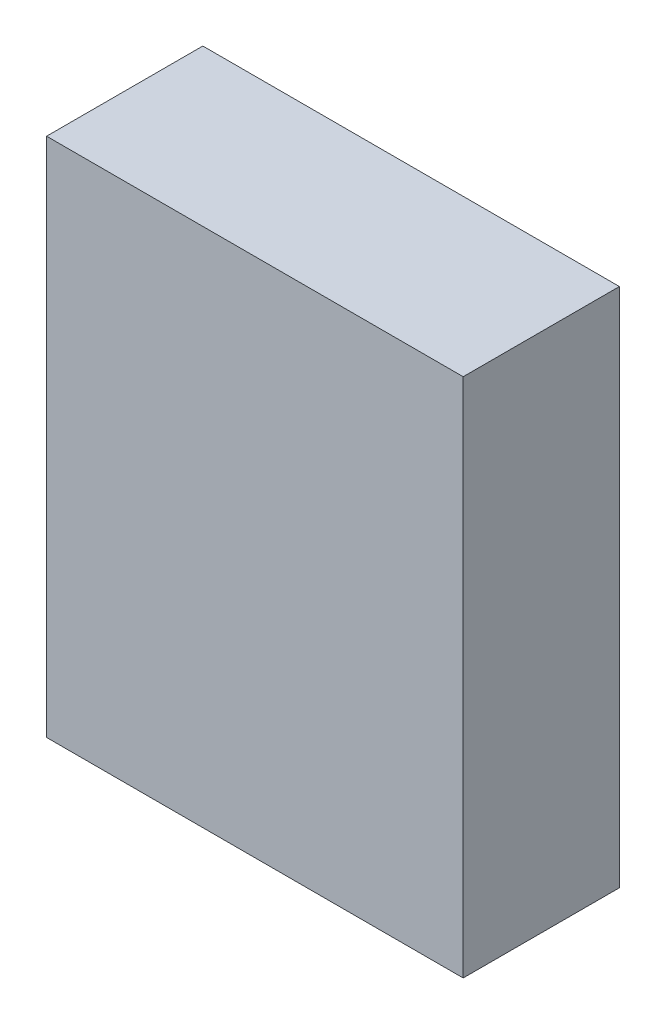
ISO-10303-21;
HEADER;
FILE_DESCRIPTION(('STEP AP214'),'2;1');
FILE_NAME('part.step','',(''),(''),'','','');
FILE_SCHEMA(('AUTOMOTIVE_DESIGN { 1 0 10303 214 1 1 1 1 }'));
ENDSEC;
DATA;
#1=APPLICATION_CONTEXT('core data for automotive mechanical design processes');
#2=APPLICATION_PROTOCOL_DEFINITION('international standard','automotive_design',2000,#1);
#3=PRODUCT_CONTEXT('',#1,'mechanical');
#4=PRODUCT('Part','Part','',(#3));
#5=PRODUCT_RELATED_PRODUCT_CATEGORY('part','',(#4));
#6=PRODUCT_DEFINITION_FORMATION('','',#4);
#7=PRODUCT_DEFINITION_CONTEXT('part definition',#1,'design');
#8=PRODUCT_DEFINITION('design','',#6,#7);
#9=PRODUCT_DEFINITION_SHAPE('','',#8);
#10=(LENGTH_UNIT() NAMED_UNIT(*) SI_UNIT(.MILLI.,.METRE.));
#11=(NAMED_UNIT(*) PLANE_ANGLE_UNIT() SI_UNIT($,.RADIAN.));
#12=(NAMED_UNIT(*) SI_UNIT($,.STERADIAN.) SOLID_ANGLE_UNIT());
#13=UNCERTAINTY_MEASURE_WITH_UNIT(LENGTH_MEASURE(1.E-05),#10,'distance_accuracy_value','');
#14=(GEOMETRIC_REPRESENTATION_CONTEXT(3) GLOBAL_UNCERTAINTY_ASSIGNED_CONTEXT((#13)) GLOBAL_UNIT_ASSIGNED_CONTEXT((#10,
#11,#12)) REPRESENTATION_CONTEXT('',''));
#15=CARTESIAN_POINT('',(0.,0.,0.));
#16=DIRECTION('',(0.,0.,1.));
#17=DIRECTION('',(1.,0.,0.));
#18=AXIS2_PLACEMENT_3D('',#15,#16,#17);
#19=CARTESIAN_POINT('',(2.,2.5,0.));
#20=DIRECTION('',(0.,1.,0.));
#21=DIRECTION('',(-1.,0.,0.));
#22=AXIS2_PLACEMENT_3D('',#19,#20,#21);
#23=PLANE('',#22);
#24=DIRECTION('',(-1.,0.,0.));
#25=VECTOR('',#24,1.);
#26=CARTESIAN_POINT('',(2.,2.5,0.));
#27=LINE('',#26,#25);
#28=CARTESIAN_POINT('',(2.,2.5,0.));
#29=VERTEX_POINT('',#28);
#30=CARTESIAN_POINT('',(-2.,2.5,0.));
#31=VERTEX_POINT('',#30);
#32=EDGE_CURVE('E11',#29,#31,#27,.T.);
#33=ORIENTED_EDGE('',*,*,#32,.T.);
#34=DIRECTION('',(0.,0.,1.));
#35=VECTOR('',#34,1.);
#36=CARTESIAN_POINT('',(-2.,2.5,0.));
#37=LINE('',#36,#35);
#38=CARTESIAN_POINT('',(-2.,2.5,1.5));
#39=VERTEX_POINT('',#38);
#40=EDGE_CURVE('E27',#31,#39,#37,.T.);
#41=ORIENTED_EDGE('',*,*,#40,.T.);
#42=DIRECTION('',(-1.,0.,0.));
#43=VECTOR('',#42,1.);
#44=CARTESIAN_POINT('',(2.,2.5,1.5));
#45=LINE('',#44,#43);
#46=CARTESIAN_POINT('',(2.,2.5,1.5));
#47=VERTEX_POINT('',#46);
#48=EDGE_CURVE('E72',#47,#39,#45,.T.);
#49=ORIENTED_EDGE('',*,*,#48,.F.);
#50=DIRECTION('',(0.,0.,1.));
#51=VECTOR('',#50,1.);
#52=CARTESIAN_POINT('',(2.,2.5,0.));
#53=LINE('',#52,#51);
#54=EDGE_CURVE('E81',#29,#47,#53,.T.);
#55=ORIENTED_EDGE('',*,*,#54,.F.);
#56=EDGE_LOOP('',(#33,#41,#49,#55));
#57=FACE_BOUND('',#56,.T.);
#58=ADVANCED_FACE('F17',(#57),#23,.T.);
#59=CARTESIAN_POINT('',(2.,-2.5,0.));
#60=DIRECTION('',(1.,0.,0.));
#61=DIRECTION('',(0.,1.,0.));
#62=AXIS2_PLACEMENT_3D('',#59,#60,#61);
#63=PLANE('',#62);
#64=DIRECTION('',(0.,1.,0.));
#65=VECTOR('',#64,1.);
#66=CARTESIAN_POINT('',(2.,-2.5,0.));
#67=LINE('',#66,#65);
#68=CARTESIAN_POINT('',(2.,-2.5,0.));
#69=VERTEX_POINT('',#68);
#70=EDGE_CURVE('E78',#69,#29,#67,.T.);
#71=ORIENTED_EDGE('',*,*,#70,.T.);
#72=ORIENTED_EDGE('',*,*,#54,.T.);
#73=DIRECTION('',(0.,1.,0.));
#74=VECTOR('',#73,1.);
#75=CARTESIAN_POINT('',(2.,-2.5,1.5));
#76=LINE('',#75,#74);
#77=CARTESIAN_POINT('',(2.,-2.5,1.5));
#78=VERTEX_POINT('',#77);
#79=EDGE_CURVE('E65',#78,#47,#76,.T.);
#80=ORIENTED_EDGE('',*,*,#79,.F.);
#81=DIRECTION('',(0.,0.,1.));
#82=VECTOR('',#81,1.);
#83=CARTESIAN_POINT('',(2.,-2.5,0.));
#84=LINE('',#83,#82);
#85=EDGE_CURVE('E61',#69,#78,#84,.T.);
#86=ORIENTED_EDGE('',*,*,#85,.F.);
#87=EDGE_LOOP('',(#71,#72,#80,#86));
#88=FACE_BOUND('',#87,.T.);
#89=ADVANCED_FACE('F91',(#88),#63,.T.);
#90=CARTESIAN_POINT('',(-2.,-2.5,0.));
#91=DIRECTION('',(0.,-1.,0.));
#92=DIRECTION('',(1.,0.,0.));
#93=AXIS2_PLACEMENT_3D('',#90,#91,#92);
#94=PLANE('',#93);
#95=DIRECTION('',(1.,0.,0.));
#96=VECTOR('',#95,1.);
#97=CARTESIAN_POINT('',(-2.,-2.5,0.));
#98=LINE('',#97,#96);
#99=CARTESIAN_POINT('',(-2.,-2.5,0.));
#100=VERTEX_POINT('',#99);
#101=EDGE_CURVE('E84',#100,#69,#98,.T.);
#102=ORIENTED_EDGE('',*,*,#101,.T.);
#103=ORIENTED_EDGE('',*,*,#85,.T.);
#104=DIRECTION('',(1.,0.,0.));
#105=VECTOR('',#104,1.);
#106=CARTESIAN_POINT('',(-2.,-2.5,1.5));
#107=LINE('',#106,#105);
#108=CARTESIAN_POINT('',(-2.,-2.5,1.5));
#109=VERTEX_POINT('',#108);
#110=EDGE_CURVE('E59',#109,#78,#107,.T.);
#111=ORIENTED_EDGE('',*,*,#110,.F.);
#112=DIRECTION('',(0.,0.,1.));
#113=VECTOR('',#112,1.);
#114=CARTESIAN_POINT('',(-2.,-2.5,0.));
#115=LINE('',#114,#113);
#116=EDGE_CURVE('E55',#100,#109,#115,.T.);
#117=ORIENTED_EDGE('',*,*,#116,.F.);
#118=EDGE_LOOP('',(#102,#103,#111,#117));
#119=FACE_BOUND('',#118,.T.);
#120=ADVANCED_FACE('F60',(#119),#94,.T.);
#121=CARTESIAN_POINT('',(-2.,2.5,0.));
#122=DIRECTION('',(-1.,0.,0.));
#123=DIRECTION('',(0.,-1.,0.));
#124=AXIS2_PLACEMENT_3D('',#121,#122,#123);
#125=PLANE('',#124);
#126=DIRECTION('',(0.,-1.,0.));
#127=VECTOR('',#126,1.);
#128=CARTESIAN_POINT('',(-2.,2.5,0.));
#129=LINE('',#128,#127);
#130=EDGE_CURVE('E69',#31,#100,#129,.T.);
#131=ORIENTED_EDGE('',*,*,#130,.T.);
#132=ORIENTED_EDGE('',*,*,#116,.T.);
#133=DIRECTION('',(0.,-1.,0.));
#134=VECTOR('',#133,1.);
#135=CARTESIAN_POINT('',(-2.,2.5,1.5));
#136=LINE('',#135,#134);
#137=EDGE_CURVE('E21',#39,#109,#136,.T.);
#138=ORIENTED_EDGE('',*,*,#137,.F.);
#139=ORIENTED_EDGE('',*,*,#40,.F.);
#140=EDGE_LOOP('',(#131,#132,#138,#139));
#141=FACE_BOUND('',#140,.T.);
#142=ADVANCED_FACE('F67',(#141),#125,.T.);
#143=CARTESIAN_POINT('',(0.,0.,1.5));
#144=DIRECTION('',(0.,0.,1.));
#145=DIRECTION('',(1.,0.,0.));
#146=AXIS2_PLACEMENT_3D('',#143,#144,#145);
#147=PLANE('',#146);
#148=ORIENTED_EDGE('',*,*,#137,.T.);
#149=ORIENTED_EDGE('',*,*,#110,.T.);
#150=ORIENTED_EDGE('',*,*,#79,.T.);
#151=ORIENTED_EDGE('',*,*,#48,.T.);
#152=EDGE_LOOP('',(#148,#149,#150,#151));
#153=FACE_BOUND('',#152,.T.);
#154=ADVANCED_FACE('F71',(#153),#147,.T.);
#155=CARTESIAN_POINT('',(0.,0.,0.));
#156=DIRECTION('',(0.,0.,1.));
#157=DIRECTION('',(1.,0.,0.));
#158=AXIS2_PLACEMENT_3D('',#155,#156,#157);
#159=PLANE('',#158);
#160=ORIENTED_EDGE('',*,*,#130,.F.);
#161=ORIENTED_EDGE('',*,*,#32,.F.);
#162=ORIENTED_EDGE('',*,*,#70,.F.);
#163=ORIENTED_EDGE('',*,*,#101,.F.);
#164=EDGE_LOOP('',(#160,#161,#162,#163));
#165=FACE_BOUND('',#164,.T.);
#166=ADVANCED_FACE('F19',(#165),#159,.F.);
#167=CLOSED_SHELL('',(#58,#89,#120,#142,#154,#166));
#168=MANIFOLD_SOLID_BREP('B1',#167);
#169=ADVANCED_BREP_SHAPE_REPRESENTATION('',(#18,#168),#14);
#170=SHAPE_DEFINITION_REPRESENTATION(#9,#169);
ENDSEC;
END-ISO-10303-21;
